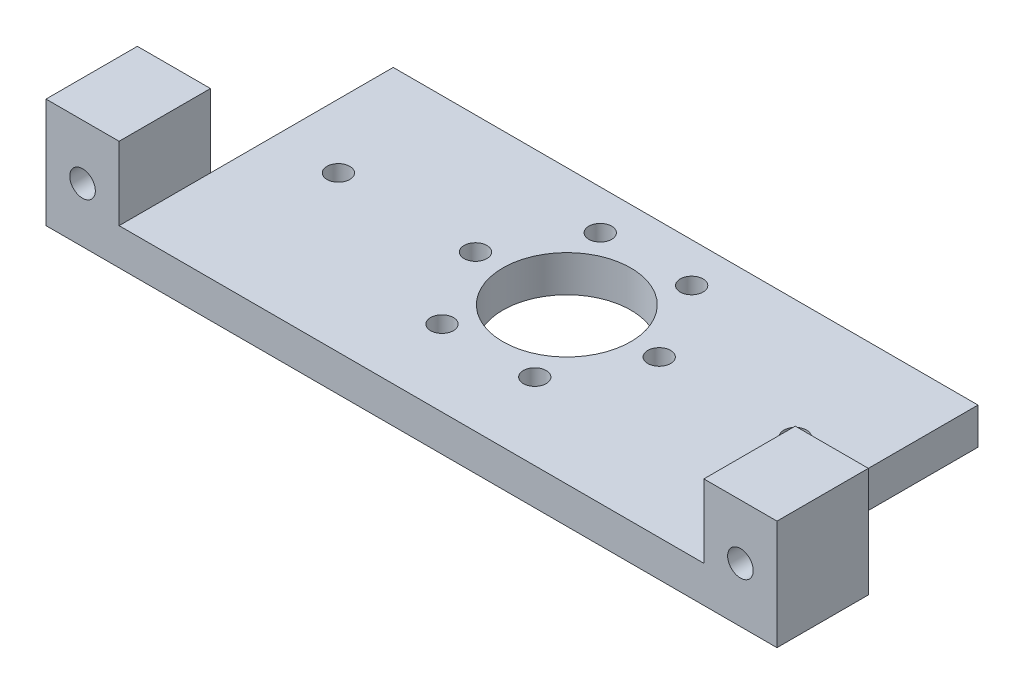
ISO-10303-21;
HEADER;
FILE_DESCRIPTION(('STEP AP214'),'2;1');
FILE_NAME('part.step','',(''),(''),'','','');
FILE_SCHEMA(('AUTOMOTIVE_DESIGN { 1 0 10303 214 1 1 1 1 }'));
ENDSEC;
DATA;
#1=APPLICATION_CONTEXT('core data for automotive mechanical design processes');
#2=APPLICATION_PROTOCOL_DEFINITION('international standard','automotive_design',2000,#1);
#3=PRODUCT_CONTEXT('',#1,'mechanical');
#4=PRODUCT('Part','Part','',(#3));
#5=PRODUCT_RELATED_PRODUCT_CATEGORY('part','',(#4));
#6=PRODUCT_DEFINITION_FORMATION('','',#4);
#7=PRODUCT_DEFINITION_CONTEXT('part definition',#1,'design');
#8=PRODUCT_DEFINITION('design','',#6,#7);
#9=PRODUCT_DEFINITION_SHAPE('','',#8);
#10=(LENGTH_UNIT() NAMED_UNIT(*) SI_UNIT(.MILLI.,.METRE.));
#11=(NAMED_UNIT(*) PLANE_ANGLE_UNIT() SI_UNIT($,.RADIAN.));
#12=(NAMED_UNIT(*) SI_UNIT($,.STERADIAN.) SOLID_ANGLE_UNIT());
#13=UNCERTAINTY_MEASURE_WITH_UNIT(LENGTH_MEASURE(1.E-05),#10,'distance_accuracy_value','');
#14=(GEOMETRIC_REPRESENTATION_CONTEXT(3) GLOBAL_UNCERTAINTY_ASSIGNED_CONTEXT((#13)) GLOBAL_UNIT_ASSIGNED_CONTEXT((#10,
#11,#12)) REPRESENTATION_CONTEXT('',''));
#15=CARTESIAN_POINT('',(0.,0.,0.));
#16=DIRECTION('',(0.,0.,1.));
#17=DIRECTION('',(1.,0.,0.));
#18=AXIS2_PLACEMENT_3D('',#15,#16,#17);
#19=CARTESIAN_POINT('',(0.,2.,0.));
#20=DIRECTION('',(0.,1.,0.));
#21=DIRECTION('',(0.,0.,1.));
#22=AXIS2_PLACEMENT_3D('',#19,#20,#21);
#23=PLANE('',#22);
#24=CARTESIAN_POINT('',(-52.3853811647955,2.,-8.1551724137931));
#25=DIRECTION('',(0.,1.,0.));
#26=DIRECTION('',(0.,0.,1.));
#27=AXIS2_PLACEMENT_3D('',#24,#25,#26);
#28=CIRCLE('',#27,0.624999999999994);
#29=CARTESIAN_POINT('',(-52.3853811647955,2.,-7.53017241379311));
#30=VERTEX_POINT('',#29);
#31=EDGE_CURVE('E227',#30,#30,#28,.T.);
#32=ORIENTED_EDGE('',*,*,#31,.F.);
#33=EDGE_LOOP('',(#32));
#34=FACE_BOUND('',#33,.T.);
#35=CARTESIAN_POINT('',(-27.3853811647955,2.,-8.15517241379311));
#36=DIRECTION('',(0.,1.,0.));
#37=DIRECTION('',(0.,0.,1.));
#38=AXIS2_PLACEMENT_3D('',#35,#36,#37);
#39=CIRCLE('',#38,0.624999999999992);
#40=CARTESIAN_POINT('',(-27.3853811647955,2.,-7.53017241379312));
#41=VERTEX_POINT('',#40);
#42=EDGE_CURVE('E233',#41,#41,#39,.T.);
#43=ORIENTED_EDGE('',*,*,#42,.F.);
#44=EDGE_LOOP('',(#43));
#45=FACE_BOUND('',#44,.T.);
#46=CARTESIAN_POINT('',(-44.8853811647955,2.,-8.1551724137931));
#47=DIRECTION('',(0.,1.,0.));
#48=DIRECTION('',(0.,0.,1.));
#49=AXIS2_PLACEMENT_3D('',#46,#47,#48);
#50=CIRCLE('',#49,0.624999999999987);
#51=CARTESIAN_POINT('',(-44.8853811647955,2.,-7.53017241379312));
#52=VERTEX_POINT('',#51);
#53=EDGE_CURVE('E188',#52,#52,#50,.T.);
#54=ORIENTED_EDGE('',*,*,#53,.F.);
#55=EDGE_LOOP('',(#54));
#56=FACE_BOUND('',#55,.T.);
#57=CARTESIAN_POINT('',(-42.3853811647955,2.,-12.4852994327153));
#58=DIRECTION('',(0.,1.,0.));
#59=DIRECTION('',(0.,0.,1.));
#60=AXIS2_PLACEMENT_3D('',#57,#58,#59);
#61=CIRCLE('',#60,0.624999999999987);
#62=CARTESIAN_POINT('',(-42.3853811647955,2.,-11.8602994327153));
#63=VERTEX_POINT('',#62);
#64=EDGE_CURVE('E245',#63,#63,#61,.T.);
#65=ORIENTED_EDGE('',*,*,#64,.F.);
#66=EDGE_LOOP('',(#65));
#67=FACE_BOUND('',#66,.T.);
#68=CARTESIAN_POINT('',(-37.3853811647954,2.,-12.4852994327153));
#69=DIRECTION('',(0.,1.,0.));
#70=DIRECTION('',(0.,0.,1.));
#71=AXIS2_PLACEMENT_3D('',#68,#69,#70);
#72=CIRCLE('',#71,0.624999999999987);
#73=CARTESIAN_POINT('',(-37.3853811647954,2.,-11.8602994327153));
#74=VERTEX_POINT('',#73);
#75=EDGE_CURVE('E251',#74,#74,#72,.T.);
#76=ORIENTED_EDGE('',*,*,#75,.F.);
#77=EDGE_LOOP('',(#76));
#78=FACE_BOUND('',#77,.T.);
#79=CARTESIAN_POINT('',(-34.8856846225404,2.,-8.21025857687513));
#80=DIRECTION('',(0.,1.,0.));
#81=DIRECTION('',(0.,0.,1.));
#82=AXIS2_PLACEMENT_3D('',#79,#80,#81);
#83=CIRCLE('',#82,0.624999999999987);
#84=CARTESIAN_POINT('',(-34.8856846225404,2.,-7.58525857687515));
#85=VERTEX_POINT('',#84);
#86=EDGE_CURVE('E257',#85,#85,#83,.T.);
#87=ORIENTED_EDGE('',*,*,#86,.F.);
#88=EDGE_LOOP('',(#87));
#89=FACE_BOUND('',#88,.T.);
#90=CARTESIAN_POINT('',(-37.3378268770419,2.,-3.85285127852804));
#91=DIRECTION('',(0.,1.,0.));
#92=DIRECTION('',(0.,0.,1.));
#93=AXIS2_PLACEMENT_3D('',#90,#91,#92);
#94=CIRCLE('',#93,0.624999999999987);
#95=CARTESIAN_POINT('',(-37.3378268770419,2.,-3.22785127852805));
#96=VERTEX_POINT('',#95);
#97=EDGE_CURVE('E263',#96,#96,#94,.T.);
#98=ORIENTED_EDGE('',*,*,#97,.F.);
#99=EDGE_LOOP('',(#98));
#100=FACE_BOUND('',#99,.T.);
#101=CARTESIAN_POINT('',(-42.3853811647955,2.,-3.82504539487091));
#102=DIRECTION('',(0.,1.,0.));
#103=DIRECTION('',(0.,0.,1.));
#104=AXIS2_PLACEMENT_3D('',#101,#102,#103);
#105=CIRCLE('',#104,0.624999999999987);
#106=CARTESIAN_POINT('',(-42.3853811647955,2.,-3.20004539487092));
#107=VERTEX_POINT('',#106);
#108=EDGE_CURVE('E269',#107,#107,#105,.T.);
#109=ORIENTED_EDGE('',*,*,#108,.F.);
#110=EDGE_LOOP('',(#109));
#111=FACE_BOUND('',#110,.T.);
#112=CARTESIAN_POINT('',(-39.8853811647955,2.,-8.1551724137931));
#113=DIRECTION('',(0.,1.,0.));
#114=DIRECTION('',(0.,0.,1.));
#115=AXIS2_PLACEMENT_3D('',#112,#113,#114);
#116=CIRCLE('',#115,3.49999999999999);
#117=CARTESIAN_POINT('',(-39.8853811647955,2.,-4.65517241379312));
#118=VERTEX_POINT('',#117);
#119=EDGE_CURVE('E161',#118,#118,#116,.T.);
#120=ORIENTED_EDGE('',*,*,#119,.F.);
#121=EDGE_LOOP('',(#120));
#122=FACE_BOUND('',#121,.T.);
#123=DIRECTION('',(1.,0.,0.));
#124=VECTOR('',#123,1.);
#125=CARTESIAN_POINT('',(-59.8853811647955,2.,0.344827586206901));
#126=LINE('',#125,#124);
#127=CARTESIAN_POINT('',(-55.8853811647955,2.,0.344827586206901));
#128=VERTEX_POINT('',#127);
#129=CARTESIAN_POINT('',(-23.8853811647955,2.,0.344827586206901));
#130=VERTEX_POINT('',#129);
#131=EDGE_CURVE('E171',#128,#130,#126,.T.);
#132=ORIENTED_EDGE('',*,*,#131,.T.);
#133=DIRECTION('',(0.,0.,1.));
#134=VECTOR('',#133,1.);
#135=CARTESIAN_POINT('',(-23.8853811647955,2.,-14.6551724137931));
#136=LINE('',#135,#134);
#137=CARTESIAN_POINT('',(-23.8853811647955,2.,-4.6551724137931));
#138=VERTEX_POINT('',#137);
#139=EDGE_CURVE('E286',#138,#130,#136,.T.);
#140=ORIENTED_EDGE('',*,*,#139,.F.);
#141=CARTESIAN_POINT('',(-23.8853811647955,2.,-14.6551724137931));
#142=VERTEX_POINT('',#141);
#143=EDGE_CURVE('E152',#142,#138,#136,.T.);
#144=ORIENTED_EDGE('',*,*,#143,.F.);
#145=DIRECTION('',(-1.,0.,0.));
#146=VECTOR('',#145,1.);
#147=CARTESIAN_POINT('',(-59.8853811647955,2.,-14.6551724137931));
#148=LINE('',#147,#146);
#149=CARTESIAN_POINT('',(-55.8853811647955,2.,-14.6551724137931));
#150=VERTEX_POINT('',#149);
#151=EDGE_CURVE('E168',#142,#150,#148,.T.);
#152=ORIENTED_EDGE('',*,*,#151,.T.);
#153=DIRECTION('',(0.,0.,-1.));
#154=VECTOR('',#153,1.);
#155=CARTESIAN_POINT('',(-55.8853811647955,2.,0.));
#156=LINE('',#155,#154);
#157=CARTESIAN_POINT('',(-55.8853811647955,2.,-4.6551724137931));
#158=VERTEX_POINT('',#157);
#159=EDGE_CURVE('E199',#158,#150,#156,.T.);
#160=ORIENTED_EDGE('',*,*,#159,.F.);
#161=DIRECTION('',(0.,0.,-1.));
#162=VECTOR('',#161,1.);
#163=CARTESIAN_POINT('',(-55.8853811647955,2.,-14.6551724137931));
#164=LINE('',#163,#162);
#165=EDGE_CURVE('E142',#128,#158,#164,.T.);
#166=ORIENTED_EDGE('',*,*,#165,.F.);
#167=EDGE_LOOP('',(#132,#140,#144,#152,#160,#166));
#168=FACE_BOUND('',#167,.T.);
#169=ADVANCED_FACE('F41',(#34,#45,#56,#67,#78,#89,#100,#111,#122,#168),#23,.T.);
#170=CARTESIAN_POINT('',(-19.8853811647955,2.,-14.6551724137931));
#171=DIRECTION('',(-1.,0.,0.));
#172=DIRECTION('',(0.,0.,1.));
#173=AXIS2_PLACEMENT_3D('',#170,#171,#172);
#174=PLANE('',#173);
#175=DIRECTION('',(0.,0.,-1.));
#176=VECTOR('',#175,1.);
#177=CARTESIAN_POINT('',(-19.8853811647955,0.,-14.6551724137931));
#178=LINE('',#177,#176);
#179=CARTESIAN_POINT('',(-19.8853811647955,0.,0.344827586206901));
#180=VERTEX_POINT('',#179);
#181=CARTESIAN_POINT('',(-19.8853811647955,0.,-4.6551724137931));
#182=VERTEX_POINT('',#181);
#183=EDGE_CURVE('E165',#180,#182,#178,.T.);
#184=ORIENTED_EDGE('',*,*,#183,.T.);
#185=DIRECTION('',(0.,-1.,0.));
#186=VECTOR('',#185,1.);
#187=CARTESIAN_POINT('',(-19.8853811647955,0.,-4.6551724137931));
#188=LINE('',#187,#186);
#189=CARTESIAN_POINT('',(-19.8853811647955,6.,-4.6551724137931));
#190=VERTEX_POINT('',#189);
#191=EDGE_CURVE('E215',#190,#182,#188,.T.);
#192=ORIENTED_EDGE('',*,*,#191,.F.);
#193=DIRECTION('',(0.,0.,-1.));
#194=VECTOR('',#193,1.);
#195=CARTESIAN_POINT('',(-19.8853811647955,6.,0.344827586206901));
#196=LINE('',#195,#194);
#197=CARTESIAN_POINT('',(-19.8853811647955,6.,0.344827586206901));
#198=VERTEX_POINT('',#197);
#199=EDGE_CURVE('E287',#198,#190,#196,.T.);
#200=ORIENTED_EDGE('',*,*,#199,.F.);
#201=DIRECTION('',(0.,-1.,0.));
#202=VECTOR('',#201,1.);
#203=CARTESIAN_POINT('',(-19.8853811647955,2.,0.344827586206901));
#204=LINE('',#203,#202);
#205=EDGE_CURVE('E50',#198,#180,#204,.T.);
#206=ORIENTED_EDGE('',*,*,#205,.T.);
#207=EDGE_LOOP('',(#184,#192,#200,#206));
#208=FACE_BOUND('',#207,.T.);
#209=ADVANCED_FACE('F43',(#208),#174,.F.);
#210=CARTESIAN_POINT('',(-59.8853811647955,2.,-14.6551724137931));
#211=DIRECTION('',(0.,0.,1.));
#212=DIRECTION('',(1.,0.,0.));
#213=AXIS2_PLACEMENT_3D('',#210,#211,#212);
#214=PLANE('',#213);
#215=DIRECTION('',(-1.,0.,0.));
#216=VECTOR('',#215,1.);
#217=CARTESIAN_POINT('',(-59.8853811647955,0.,-14.6551724137931));
#218=LINE('',#217,#216);
#219=CARTESIAN_POINT('',(-23.8853811647955,0.,-14.6551724137931));
#220=VERTEX_POINT('',#219);
#221=CARTESIAN_POINT('',(-55.8853811647955,0.,-14.6551724137931));
#222=VERTEX_POINT('',#221);
#223=EDGE_CURVE('E177',#220,#222,#218,.T.);
#224=ORIENTED_EDGE('',*,*,#223,.T.);
#225=DIRECTION('',(0.,-1.,0.));
#226=VECTOR('',#225,1.);
#227=CARTESIAN_POINT('',(-55.8853811647955,6.,-14.6551724137931));
#228=LINE('',#227,#226);
#229=EDGE_CURVE('E209',#150,#222,#228,.T.);
#230=ORIENTED_EDGE('',*,*,#229,.F.);
#231=ORIENTED_EDGE('',*,*,#151,.F.);
#232=DIRECTION('',(0.,1.,0.));
#233=VECTOR('',#232,1.);
#234=CARTESIAN_POINT('',(-23.8853811647955,0.,-14.6551724137931));
#235=LINE('',#234,#233);
#236=EDGE_CURVE('E213',#220,#142,#235,.T.);
#237=ORIENTED_EDGE('',*,*,#236,.F.);
#238=EDGE_LOOP('',(#224,#230,#231,#237));
#239=FACE_BOUND('',#238,.T.);
#240=ADVANCED_FACE('F308',(#239),#214,.F.);
#241=CARTESIAN_POINT('',(-59.8853811647955,2.,-14.6551724137931));
#242=DIRECTION('',(1.,0.,0.));
#243=DIRECTION('',(0.,0.,-1.));
#244=AXIS2_PLACEMENT_3D('',#241,#242,#243);
#245=PLANE('',#244);
#246=DIRECTION('',(0.,0.,1.));
#247=VECTOR('',#246,1.);
#248=CARTESIAN_POINT('',(-59.8853811647955,6.,0.344827586206901));
#249=LINE('',#248,#247);
#250=CARTESIAN_POINT('',(-59.8853811647955,6.,-4.6551724137931));
#251=VERTEX_POINT('',#250);
#252=CARTESIAN_POINT('',(-59.8853811647955,6.,0.344827586206901));
#253=VERTEX_POINT('',#252);
#254=EDGE_CURVE('E149',#251,#253,#249,.T.);
#255=ORIENTED_EDGE('',*,*,#254,.F.);
#256=DIRECTION('',(0.,1.,0.));
#257=VECTOR('',#256,1.);
#258=CARTESIAN_POINT('',(-59.8853811647955,6.,-4.6551724137931));
#259=LINE('',#258,#257);
#260=CARTESIAN_POINT('',(-59.8853811647955,0.,-4.6551724137931));
#261=VERTEX_POINT('',#260);
#262=EDGE_CURVE('E58',#261,#251,#259,.T.);
#263=ORIENTED_EDGE('',*,*,#262,.F.);
#264=DIRECTION('',(0.,0.,1.));
#265=VECTOR('',#264,1.);
#266=CARTESIAN_POINT('',(-59.8853811647955,0.,-14.6551724137931));
#267=LINE('',#266,#265);
#268=CARTESIAN_POINT('',(-59.8853811647955,0.,0.344827586206901));
#269=VERTEX_POINT('',#268);
#270=EDGE_CURVE('E180',#261,#269,#267,.T.);
#271=ORIENTED_EDGE('',*,*,#270,.T.);
#272=DIRECTION('',(0.,-1.,0.));
#273=VECTOR('',#272,1.);
#274=CARTESIAN_POINT('',(-59.8853811647955,2.,0.344827586206901));
#275=LINE('',#274,#273);
#276=EDGE_CURVE('E11',#253,#269,#275,.T.);
#277=ORIENTED_EDGE('',*,*,#276,.F.);
#278=EDGE_LOOP('',(#255,#263,#271,#277));
#279=FACE_BOUND('',#278,.T.);
#280=ADVANCED_FACE('F325',(#279),#245,.F.);
#281=CARTESIAN_POINT('',(-59.8853811647955,2.,0.344827586206901));
#282=DIRECTION('',(0.,0.,-1.));
#283=DIRECTION('',(-1.,0.,0.));
#284=AXIS2_PLACEMENT_3D('',#281,#282,#283);
#285=PLANE('',#284);
#286=CARTESIAN_POINT('',(-57.8853811647955,3.,0.344827586206901));
#287=DIRECTION('',(0.,0.,-1.));
#288=DIRECTION('',(-1.,0.,0.));
#289=AXIS2_PLACEMENT_3D('',#286,#287,#288);
#290=CIRCLE('',#289,0.700000000000001);
#291=CARTESIAN_POINT('',(-58.5853811647955,3.,0.344827586206901));
#292=VERTEX_POINT('',#291);
#293=EDGE_CURVE('E276',#292,#292,#290,.T.);
#294=ORIENTED_EDGE('',*,*,#293,.T.);
#295=EDGE_LOOP('',(#294));
#296=FACE_BOUND('',#295,.T.);
#297=CARTESIAN_POINT('',(-21.8853811647955,3.,0.344827586206901));
#298=DIRECTION('',(0.,0.,-1.));
#299=DIRECTION('',(-1.,0.,0.));
#300=AXIS2_PLACEMENT_3D('',#297,#298,#299);
#301=CIRCLE('',#300,0.699999999999998);
#302=CARTESIAN_POINT('',(-22.5853811647955,3.,0.344827586206901));
#303=VERTEX_POINT('',#302);
#304=EDGE_CURVE('E275',#303,#303,#301,.T.);
#305=ORIENTED_EDGE('',*,*,#304,.T.);
#306=EDGE_LOOP('',(#305));
#307=FACE_BOUND('',#306,.T.);
#308=DIRECTION('',(1.,0.,0.));
#309=VECTOR('',#308,1.);
#310=CARTESIAN_POINT('',(-59.8853811647955,0.,0.344827586206901));
#311=LINE('',#310,#309);
#312=EDGE_CURVE('E172',#269,#180,#311,.T.);
#313=ORIENTED_EDGE('',*,*,#312,.T.);
#314=ORIENTED_EDGE('',*,*,#205,.F.);
#315=DIRECTION('',(1.,0.,0.));
#316=VECTOR('',#315,1.);
#317=CARTESIAN_POINT('',(-23.8853811647955,6.,0.344827586206901));
#318=LINE('',#317,#316);
#319=CARTESIAN_POINT('',(-23.8853811647955,6.,0.344827586206901));
#320=VERTEX_POINT('',#319);
#321=EDGE_CURVE('E155',#320,#198,#318,.T.);
#322=ORIENTED_EDGE('',*,*,#321,.F.);
#323=DIRECTION('',(0.,-1.,0.));
#324=VECTOR('',#323,1.);
#325=CARTESIAN_POINT('',(-23.8853811647955,6.,0.344827586206901));
#326=LINE('',#325,#324);
#327=EDGE_CURVE('E279',#320,#130,#326,.T.);
#328=ORIENTED_EDGE('',*,*,#327,.T.);
#329=ORIENTED_EDGE('',*,*,#131,.F.);
#330=DIRECTION('',(0.,-1.,0.));
#331=VECTOR('',#330,1.);
#332=CARTESIAN_POINT('',(-55.8853811647955,6.,0.344827586206901));
#333=LINE('',#332,#331);
#334=CARTESIAN_POINT('',(-55.8853811647955,6.,0.344827586206901));
#335=VERTEX_POINT('',#334);
#336=EDGE_CURVE('E158',#335,#128,#333,.T.);
#337=ORIENTED_EDGE('',*,*,#336,.F.);
#338=DIRECTION('',(1.,0.,0.));
#339=VECTOR('',#338,1.);
#340=CARTESIAN_POINT('',(-55.8853811647955,6.,0.344827586206901));
#341=LINE('',#340,#339);
#342=EDGE_CURVE('E147',#253,#335,#341,.T.);
#343=ORIENTED_EDGE('',*,*,#342,.F.);
#344=ORIENTED_EDGE('',*,*,#276,.T.);
#345=EDGE_LOOP('',(#313,#314,#322,#328,#329,#337,#343,#344));
#346=FACE_BOUND('',#345,.T.);
#347=ADVANCED_FACE('F302',(#296,#307,#346),#285,.F.);
#348=CARTESIAN_POINT('',(0.,0.,0.));
#349=DIRECTION('',(0.,1.,0.));
#350=DIRECTION('',(0.,0.,1.));
#351=AXIS2_PLACEMENT_3D('',#348,#349,#350);
#352=PLANE('',#351);
#353=CARTESIAN_POINT('',(-27.3853811647955,0.,-8.15517241379311));
#354=DIRECTION('',(0.,1.,0.));
#355=DIRECTION('',(0.,0.,1.));
#356=AXIS2_PLACEMENT_3D('',#353,#354,#355);
#357=CIRCLE('',#356,1.);
#358=CARTESIAN_POINT('',(-27.3853811647955,0.,-7.15517241379311));
#359=VERTEX_POINT('',#358);
#360=EDGE_CURVE('E190',#359,#359,#357,.T.);
#361=ORIENTED_EDGE('',*,*,#360,.T.);
#362=EDGE_LOOP('',(#361));
#363=FACE_BOUND('',#362,.T.);
#364=CARTESIAN_POINT('',(-52.3853811647955,0.,-8.1551724137931));
#365=DIRECTION('',(0.,1.,0.));
#366=DIRECTION('',(0.,0.,1.));
#367=AXIS2_PLACEMENT_3D('',#364,#365,#366);
#368=CIRCLE('',#367,0.999999999999998);
#369=CARTESIAN_POINT('',(-52.3853811647955,0.,-7.1551724137931));
#370=VERTEX_POINT('',#369);
#371=EDGE_CURVE('E185',#370,#370,#368,.T.);
#372=ORIENTED_EDGE('',*,*,#371,.T.);
#373=EDGE_LOOP('',(#372));
#374=FACE_BOUND('',#373,.T.);
#375=CARTESIAN_POINT('',(-44.8853811647955,0.,-8.1551724137931));
#376=DIRECTION('',(0.,1.,0.));
#377=DIRECTION('',(0.,0.,1.));
#378=AXIS2_PLACEMENT_3D('',#375,#376,#377);
#379=CIRCLE('',#378,0.624999999999987);
#380=CARTESIAN_POINT('',(-44.8853811647955,0.,-7.53017241379312));
#381=VERTEX_POINT('',#380);
#382=EDGE_CURVE('E242',#381,#381,#379,.T.);
#383=ORIENTED_EDGE('',*,*,#382,.T.);
#384=EDGE_LOOP('',(#383));
#385=FACE_BOUND('',#384,.T.);
#386=CARTESIAN_POINT('',(-42.3853811647955,0.,-12.4852994327153));
#387=DIRECTION('',(0.,1.,0.));
#388=DIRECTION('',(0.,0.,1.));
#389=AXIS2_PLACEMENT_3D('',#386,#387,#388);
#390=CIRCLE('',#389,0.624999999999987);
#391=CARTESIAN_POINT('',(-42.3853811647955,0.,-11.8602994327153));
#392=VERTEX_POINT('',#391);
#393=EDGE_CURVE('E248',#392,#392,#390,.T.);
#394=ORIENTED_EDGE('',*,*,#393,.T.);
#395=EDGE_LOOP('',(#394));
#396=FACE_BOUND('',#395,.T.);
#397=CARTESIAN_POINT('',(-37.3853811647954,0.,-12.4852994327153));
#398=DIRECTION('',(0.,1.,0.));
#399=DIRECTION('',(0.,0.,1.));
#400=AXIS2_PLACEMENT_3D('',#397,#398,#399);
#401=CIRCLE('',#400,0.624999999999987);
#402=CARTESIAN_POINT('',(-37.3853811647954,0.,-11.8602994327153));
#403=VERTEX_POINT('',#402);
#404=EDGE_CURVE('E254',#403,#403,#401,.T.);
#405=ORIENTED_EDGE('',*,*,#404,.T.);
#406=EDGE_LOOP('',(#405));
#407=FACE_BOUND('',#406,.T.);
#408=CARTESIAN_POINT('',(-34.8856846225404,0.,-8.21025857687513));
#409=DIRECTION('',(0.,1.,0.));
#410=DIRECTION('',(0.,0.,1.));
#411=AXIS2_PLACEMENT_3D('',#408,#409,#410);
#412=CIRCLE('',#411,0.624999999999987);
#413=CARTESIAN_POINT('',(-34.8856846225404,0.,-7.58525857687515));
#414=VERTEX_POINT('',#413);
#415=EDGE_CURVE('E260',#414,#414,#412,.T.);
#416=ORIENTED_EDGE('',*,*,#415,.T.);
#417=EDGE_LOOP('',(#416));
#418=FACE_BOUND('',#417,.T.);
#419=CARTESIAN_POINT('',(-37.3378268770419,0.,-3.85285127852804));
#420=DIRECTION('',(0.,1.,0.));
#421=DIRECTION('',(0.,0.,1.));
#422=AXIS2_PLACEMENT_3D('',#419,#420,#421);
#423=CIRCLE('',#422,0.624999999999987);
#424=CARTESIAN_POINT('',(-37.3378268770419,0.,-3.22785127852805));
#425=VERTEX_POINT('',#424);
#426=EDGE_CURVE('E266',#425,#425,#423,.T.);
#427=ORIENTED_EDGE('',*,*,#426,.T.);
#428=EDGE_LOOP('',(#427));
#429=FACE_BOUND('',#428,.T.);
#430=CARTESIAN_POINT('',(-42.3853811647955,0.,-3.82504539487091));
#431=DIRECTION('',(0.,1.,0.));
#432=DIRECTION('',(0.,0.,1.));
#433=AXIS2_PLACEMENT_3D('',#430,#431,#432);
#434=CIRCLE('',#433,0.624999999999987);
#435=CARTESIAN_POINT('',(-42.3853811647955,0.,-3.20004539487092));
#436=VERTEX_POINT('',#435);
#437=EDGE_CURVE('E272',#436,#436,#434,.T.);
#438=ORIENTED_EDGE('',*,*,#437,.T.);
#439=EDGE_LOOP('',(#438));
#440=FACE_BOUND('',#439,.T.);
#441=CARTESIAN_POINT('',(-39.8853811647955,0.,-8.1551724137931));
#442=DIRECTION('',(0.,1.,0.));
#443=DIRECTION('',(0.,0.,1.));
#444=AXIS2_PLACEMENT_3D('',#441,#442,#443);
#445=CIRCLE('',#444,3.49999999999999);
#446=CARTESIAN_POINT('',(-39.8853811647955,0.,-4.65517241379312));
#447=VERTEX_POINT('',#446);
#448=EDGE_CURVE('E162',#447,#447,#445,.T.);
#449=ORIENTED_EDGE('',*,*,#448,.T.);
#450=EDGE_LOOP('',(#449));
#451=FACE_BOUND('',#450,.T.);
#452=DIRECTION('',(-1.,0.,0.));
#453=VECTOR('',#452,1.);
#454=CARTESIAN_POINT('',(-59.8853811647955,0.,-4.6551724137931));
#455=LINE('',#454,#453);
#456=CARTESIAN_POINT('',(-55.8853811647955,0.,-4.6551724137931));
#457=VERTEX_POINT('',#456);
#458=EDGE_CURVE('E143',#457,#261,#455,.T.);
#459=ORIENTED_EDGE('',*,*,#458,.F.);
#460=DIRECTION('',(0.,0.,-1.));
#461=VECTOR('',#460,1.);
#462=CARTESIAN_POINT('',(-55.8853811647955,0.,-4.6551724137931));
#463=LINE('',#462,#461);
#464=EDGE_CURVE('E195',#457,#222,#463,.T.);
#465=ORIENTED_EDGE('',*,*,#464,.T.);
#466=ORIENTED_EDGE('',*,*,#223,.F.);
#467=DIRECTION('',(0.,0.,-1.));
#468=VECTOR('',#467,1.);
#469=CARTESIAN_POINT('',(-23.8853811647955,0.,-4.6551724137931));
#470=LINE('',#469,#468);
#471=CARTESIAN_POINT('',(-23.8853811647955,0.,-4.6551724137931));
#472=VERTEX_POINT('',#471);
#473=EDGE_CURVE('E210',#472,#220,#470,.T.);
#474=ORIENTED_EDGE('',*,*,#473,.F.);
#475=DIRECTION('',(-1.,0.,0.));
#476=VECTOR('',#475,1.);
#477=CARTESIAN_POINT('',(-19.8853811647955,0.,-4.6551724137931));
#478=LINE('',#477,#476);
#479=EDGE_CURVE('E219',#182,#472,#478,.T.);
#480=ORIENTED_EDGE('',*,*,#479,.F.);
#481=ORIENTED_EDGE('',*,*,#183,.F.);
#482=ORIENTED_EDGE('',*,*,#312,.F.);
#483=ORIENTED_EDGE('',*,*,#270,.F.);
#484=EDGE_LOOP('',(#459,#465,#466,#474,#480,#481,#482,#483));
#485=FACE_BOUND('',#484,.T.);
#486=ADVANCED_FACE('F312',(#363,#374,#385,#396,#407,#418,#429,#440,#451,#485),#352,.F.);
#487=CARTESIAN_POINT('',(-39.8853811647955,0.,-8.1551724137931));
#488=DIRECTION('',(0.,1.,0.));
#489=DIRECTION('',(0.,0.,1.));
#490=AXIS2_PLACEMENT_3D('',#487,#488,#489);
#491=CYLINDRICAL_SURFACE('',#490,3.49999999999999);
#492=ORIENTED_EDGE('',*,*,#448,.F.);
#493=EDGE_LOOP('',(#492));
#494=FACE_BOUND('',#493,.T.);
#495=ORIENTED_EDGE('',*,*,#119,.T.);
#496=EDGE_LOOP('',(#495));
#497=FACE_BOUND('',#496,.T.);
#498=ADVANCED_FACE('F346',(#494,#497),#491,.F.);
#499=CARTESIAN_POINT('',(-55.8853811647955,6.,-14.6551724137931));
#500=DIRECTION('',(-1.,0.,0.));
#501=DIRECTION('',(0.,0.,1.));
#502=AXIS2_PLACEMENT_3D('',#499,#500,#501);
#503=PLANE('',#502);
#504=ORIENTED_EDGE('',*,*,#165,.T.);
#505=DIRECTION('',(0.,-1.,0.));
#506=VECTOR('',#505,1.);
#507=CARTESIAN_POINT('',(-55.8853811647955,6.,-4.6551724137931));
#508=LINE('',#507,#506);
#509=CARTESIAN_POINT('',(-55.8853811647955,6.,-4.6551724137931));
#510=VERTEX_POINT('',#509);
#511=EDGE_CURVE('E129',#510,#158,#508,.T.);
#512=ORIENTED_EDGE('',*,*,#511,.F.);
#513=DIRECTION('',(0.,0.,-1.));
#514=VECTOR('',#513,1.);
#515=CARTESIAN_POINT('',(-55.8853811647955,6.,-14.6551724137931));
#516=LINE('',#515,#514);
#517=EDGE_CURVE('E141',#335,#510,#516,.T.);
#518=ORIENTED_EDGE('',*,*,#517,.F.);
#519=ORIENTED_EDGE('',*,*,#336,.T.);
#520=EDGE_LOOP('',(#504,#512,#518,#519));
#521=FACE_BOUND('',#520,.T.);
#522=ADVANCED_FACE('F139',(#521),#503,.F.);
#523=CARTESIAN_POINT('',(0.,6.,0.));
#524=DIRECTION('',(0.,-1.,0.));
#525=DIRECTION('',(0.,0.,-1.));
#526=AXIS2_PLACEMENT_3D('',#523,#524,#525);
#527=PLANE('',#526);
#528=ORIENTED_EDGE('',*,*,#517,.T.);
#529=DIRECTION('',(1.,0.,0.));
#530=VECTOR('',#529,1.);
#531=CARTESIAN_POINT('',(-59.8853811647955,6.,-4.6551724137931));
#532=LINE('',#531,#530);
#533=EDGE_CURVE('E125',#251,#510,#532,.T.);
#534=ORIENTED_EDGE('',*,*,#533,.F.);
#535=ORIENTED_EDGE('',*,*,#254,.T.);
#536=ORIENTED_EDGE('',*,*,#342,.T.);
#537=EDGE_LOOP('',(#528,#534,#535,#536));
#538=FACE_BOUND('',#537,.T.);
#539=ADVANCED_FACE('F145',(#538),#527,.F.);
#540=CARTESIAN_POINT('',(-23.8853811647955,6.,-14.6551724137931));
#541=DIRECTION('',(1.,0.,0.));
#542=DIRECTION('',(0.,0.,-1.));
#543=AXIS2_PLACEMENT_3D('',#540,#541,#542);
#544=PLANE('',#543);
#545=DIRECTION('',(0.,0.,1.));
#546=VECTOR('',#545,1.);
#547=CARTESIAN_POINT('',(-23.8853811647955,6.,-14.6551724137931));
#548=LINE('',#547,#546);
#549=CARTESIAN_POINT('',(-23.8853811647955,6.,-4.6551724137931));
#550=VERTEX_POINT('',#549);
#551=EDGE_CURVE('E284',#550,#320,#548,.T.);
#552=ORIENTED_EDGE('',*,*,#551,.F.);
#553=DIRECTION('',(0.,1.,0.));
#554=VECTOR('',#553,1.);
#555=CARTESIAN_POINT('',(-23.8853811647955,0.,-4.6551724137931));
#556=LINE('',#555,#554);
#557=EDGE_CURVE('E66',#138,#550,#556,.T.);
#558=ORIENTED_EDGE('',*,*,#557,.F.);
#559=ORIENTED_EDGE('',*,*,#139,.T.);
#560=ORIENTED_EDGE('',*,*,#327,.F.);
#561=EDGE_LOOP('',(#552,#558,#559,#560));
#562=FACE_BOUND('',#561,.T.);
#563=ADVANCED_FACE('F297',(#562),#544,.F.);
#564=CARTESIAN_POINT('',(0.,6.,0.));
#565=DIRECTION('',(0.,1.,0.));
#566=DIRECTION('',(0.,0.,1.));
#567=AXIS2_PLACEMENT_3D('',#564,#565,#566);
#568=PLANE('',#567);
#569=DIRECTION('',(1.,0.,0.));
#570=VECTOR('',#569,1.);
#571=CARTESIAN_POINT('',(-19.8853811647955,6.,-4.6551724137931));
#572=LINE('',#571,#570);
#573=EDGE_CURVE('E212',#550,#190,#572,.T.);
#574=ORIENTED_EDGE('',*,*,#573,.F.);
#575=ORIENTED_EDGE('',*,*,#551,.T.);
#576=ORIENTED_EDGE('',*,*,#321,.T.);
#577=ORIENTED_EDGE('',*,*,#199,.T.);
#578=EDGE_LOOP('',(#574,#575,#576,#577));
#579=FACE_BOUND('',#578,.T.);
#580=ADVANCED_FACE('F396',(#579),#568,.T.);
#581=CARTESIAN_POINT('',(-21.8853811647955,3.,0.344827586206901));
#582=DIRECTION('',(0.,0.,-1.));
#583=DIRECTION('',(-1.,0.,0.));
#584=AXIS2_PLACEMENT_3D('',#581,#582,#583);
#585=CYLINDRICAL_SURFACE('',#584,0.699999999999998);
#586=CARTESIAN_POINT('',(-21.8853811647955,3.,-4.6551724137931));
#587=DIRECTION('',(0.,0.,1.));
#588=DIRECTION('',(1.,0.,0.));
#589=AXIS2_PLACEMENT_3D('',#586,#587,#588);
#590=CIRCLE('',#589,0.699999999999998);
#591=CARTESIAN_POINT('',(-21.1853811647955,3.,-4.6551724137931));
#592=VERTEX_POINT('',#591);
#593=EDGE_CURVE('E45',#592,#592,#590,.F.);
#594=ORIENTED_EDGE('',*,*,#593,.T.);
#595=EDGE_LOOP('',(#594));
#596=FACE_BOUND('',#595,.T.);
#597=ORIENTED_EDGE('',*,*,#304,.F.);
#598=EDGE_LOOP('',(#597));
#599=FACE_BOUND('',#598,.T.);
#600=ADVANCED_FACE('F390',(#596,#599),#585,.F.);
#601=CARTESIAN_POINT('',(-57.8853811647955,3.,0.344827586206901));
#602=DIRECTION('',(0.,0.,-1.));
#603=DIRECTION('',(-1.,0.,0.));
#604=AXIS2_PLACEMENT_3D('',#601,#602,#603);
#605=CYLINDRICAL_SURFACE('',#604,0.700000000000001);
#606=CARTESIAN_POINT('',(-57.8853811647955,3.,-4.6551724137931));
#607=DIRECTION('',(0.,0.,1.));
#608=DIRECTION('',(1.,0.,0.));
#609=AXIS2_PLACEMENT_3D('',#606,#607,#608);
#610=CIRCLE('',#609,0.700000000000001);
#611=CARTESIAN_POINT('',(-57.1853811647955,3.,-4.6551724137931));
#612=VERTEX_POINT('',#611);
#613=EDGE_CURVE('E193',#612,#612,#610,.F.);
#614=ORIENTED_EDGE('',*,*,#613,.T.);
#615=EDGE_LOOP('',(#614));
#616=FACE_BOUND('',#615,.T.);
#617=ORIENTED_EDGE('',*,*,#293,.F.);
#618=EDGE_LOOP('',(#617));
#619=FACE_BOUND('',#618,.T.);
#620=ADVANCED_FACE('F379',(#616,#619),#605,.F.);
#621=CARTESIAN_POINT('',(-42.3853811647955,2.,-3.82504539487091));
#622=DIRECTION('',(0.,1.,0.));
#623=DIRECTION('',(0.,0.,1.));
#624=AXIS2_PLACEMENT_3D('',#621,#622,#623);
#625=CYLINDRICAL_SURFACE('',#624,0.624999999999987);
#626=ORIENTED_EDGE('',*,*,#437,.F.);
#627=EDGE_LOOP('',(#626));
#628=FACE_BOUND('',#627,.T.);
#629=ORIENTED_EDGE('',*,*,#108,.T.);
#630=EDGE_LOOP('',(#629));
#631=FACE_BOUND('',#630,.T.);
#632=ADVANCED_FACE('F375',(#628,#631),#625,.F.);
#633=CARTESIAN_POINT('',(-37.3378268770419,2.,-3.85285127852804));
#634=DIRECTION('',(0.,1.,0.));
#635=DIRECTION('',(0.,0.,1.));
#636=AXIS2_PLACEMENT_3D('',#633,#634,#635);
#637=CYLINDRICAL_SURFACE('',#636,0.624999999999987);
#638=ORIENTED_EDGE('',*,*,#426,.F.);
#639=EDGE_LOOP('',(#638));
#640=FACE_BOUND('',#639,.T.);
#641=ORIENTED_EDGE('',*,*,#97,.T.);
#642=EDGE_LOOP('',(#641));
#643=FACE_BOUND('',#642,.T.);
#644=ADVANCED_FACE('F378',(#640,#643),#637,.F.);
#645=CARTESIAN_POINT('',(-34.8856846225404,2.,-8.21025857687513));
#646=DIRECTION('',(0.,1.,0.));
#647=DIRECTION('',(0.,0.,1.));
#648=AXIS2_PLACEMENT_3D('',#645,#646,#647);
#649=CYLINDRICAL_SURFACE('',#648,0.624999999999987);
#650=ORIENTED_EDGE('',*,*,#415,.F.);
#651=EDGE_LOOP('',(#650));
#652=FACE_BOUND('',#651,.T.);
#653=ORIENTED_EDGE('',*,*,#86,.T.);
#654=EDGE_LOOP('',(#653));
#655=FACE_BOUND('',#654,.T.);
#656=ADVANCED_FACE('F386',(#652,#655),#649,.F.);
#657=CARTESIAN_POINT('',(-37.3853811647954,2.,-12.4852994327153));
#658=DIRECTION('',(0.,1.,0.));
#659=DIRECTION('',(0.,0.,1.));
#660=AXIS2_PLACEMENT_3D('',#657,#658,#659);
#661=CYLINDRICAL_SURFACE('',#660,0.624999999999987);
#662=ORIENTED_EDGE('',*,*,#404,.F.);
#663=EDGE_LOOP('',(#662));
#664=FACE_BOUND('',#663,.T.);
#665=ORIENTED_EDGE('',*,*,#75,.T.);
#666=EDGE_LOOP('',(#665));
#667=FACE_BOUND('',#666,.T.);
#668=ADVANCED_FACE('F534',(#664,#667),#661,.F.);
#669=CARTESIAN_POINT('',(-42.3853811647955,2.,-12.4852994327153));
#670=DIRECTION('',(0.,1.,0.));
#671=DIRECTION('',(0.,0.,1.));
#672=AXIS2_PLACEMENT_3D('',#669,#670,#671);
#673=CYLINDRICAL_SURFACE('',#672,0.624999999999987);
#674=ORIENTED_EDGE('',*,*,#393,.F.);
#675=EDGE_LOOP('',(#674));
#676=FACE_BOUND('',#675,.T.);
#677=ORIENTED_EDGE('',*,*,#64,.T.);
#678=EDGE_LOOP('',(#677));
#679=FACE_BOUND('',#678,.T.);
#680=ADVANCED_FACE('F525',(#676,#679),#673,.F.);
#681=CARTESIAN_POINT('',(-44.8853811647955,2.,-8.1551724137931));
#682=DIRECTION('',(0.,1.,0.));
#683=DIRECTION('',(0.,0.,1.));
#684=AXIS2_PLACEMENT_3D('',#681,#682,#683);
#685=CYLINDRICAL_SURFACE('',#684,0.624999999999987);
#686=ORIENTED_EDGE('',*,*,#382,.F.);
#687=EDGE_LOOP('',(#686));
#688=FACE_BOUND('',#687,.T.);
#689=ORIENTED_EDGE('',*,*,#53,.T.);
#690=EDGE_LOOP('',(#689));
#691=FACE_BOUND('',#690,.T.);
#692=ADVANCED_FACE('F516',(#688,#691),#685,.F.);
#693=CARTESIAN_POINT('',(-52.3853811647955,-2.,-8.1551724137931));
#694=DIRECTION('',(0.,1.,0.));
#695=DIRECTION('',(0.,0.,1.));
#696=AXIS2_PLACEMENT_3D('',#693,#694,#695);
#697=CYLINDRICAL_SURFACE('',#696,0.999999999999998);
#698=CARTESIAN_POINT('',(-52.3853811647955,-2.,-8.1551724137931));
#699=DIRECTION('',(0.,1.,0.));
#700=DIRECTION('',(0.,0.,1.));
#701=AXIS2_PLACEMENT_3D('',#698,#699,#700);
#702=CIRCLE('',#701,0.999999999999998);
#703=CARTESIAN_POINT('',(-52.3853811647955,-2.,-7.1551724137931));
#704=VERTEX_POINT('',#703);
#705=EDGE_CURVE('E189',#704,#704,#702,.T.);
#706=ORIENTED_EDGE('',*,*,#705,.T.);
#707=EDGE_LOOP('',(#706));
#708=FACE_BOUND('',#707,.T.);
#709=ORIENTED_EDGE('',*,*,#371,.F.);
#710=EDGE_LOOP('',(#709));
#711=FACE_BOUND('',#710,.T.);
#712=ADVANCED_FACE('F507',(#708,#711),#697,.T.);
#713=CARTESIAN_POINT('',(-52.3853811647955,-2.,-8.1551724137931));
#714=DIRECTION('',(0.,1.,0.));
#715=DIRECTION('',(0.,0.,1.));
#716=AXIS2_PLACEMENT_3D('',#713,#714,#715);
#717=PLANE('',#716);
#718=CARTESIAN_POINT('',(-52.3853811647955,-2.,-8.1551724137931));
#719=DIRECTION('',(0.,-1.,0.));
#720=DIRECTION('',(0.,0.,-1.));
#721=AXIS2_PLACEMENT_3D('',#718,#719,#720);
#722=CIRCLE('',#721,0.624999999999987);
#723=CARTESIAN_POINT('',(-52.3853811647955,-2.,-8.78017241379309));
#724=VERTEX_POINT('',#723);
#725=EDGE_CURVE('E224',#724,#724,#722,.T.);
#726=ORIENTED_EDGE('',*,*,#725,.F.);
#727=EDGE_LOOP('',(#726));
#728=FACE_BOUND('',#727,.T.);
#729=ORIENTED_EDGE('',*,*,#705,.F.);
#730=EDGE_LOOP('',(#729));
#731=FACE_BOUND('',#730,.T.);
#732=ADVANCED_FACE('F498',(#728,#731),#717,.F.);
#733=CARTESIAN_POINT('',(-27.3853811647955,-2.,-8.15517241379311));
#734=DIRECTION('',(0.,1.,0.));
#735=DIRECTION('',(0.,0.,1.));
#736=AXIS2_PLACEMENT_3D('',#733,#734,#735);
#737=CYLINDRICAL_SURFACE('',#736,1.);
#738=CARTESIAN_POINT('',(-27.3853811647955,-2.,-8.15517241379311));
#739=DIRECTION('',(0.,1.,0.));
#740=DIRECTION('',(0.,0.,1.));
#741=AXIS2_PLACEMENT_3D('',#738,#739,#740);
#742=CIRCLE('',#741,1.);
#743=CARTESIAN_POINT('',(-27.3853811647955,-2.,-7.15517241379311));
#744=VERTEX_POINT('',#743);
#745=EDGE_CURVE('E192',#744,#744,#742,.T.);
#746=ORIENTED_EDGE('',*,*,#745,.T.);
#747=EDGE_LOOP('',(#746));
#748=FACE_BOUND('',#747,.T.);
#749=ORIENTED_EDGE('',*,*,#360,.F.);
#750=EDGE_LOOP('',(#749));
#751=FACE_BOUND('',#750,.T.);
#752=ADVANCED_FACE('F489',(#748,#751),#737,.T.);
#753=CARTESIAN_POINT('',(-27.3853811647955,-2.,-8.15517241379311));
#754=DIRECTION('',(0.,1.,0.));
#755=DIRECTION('',(0.,0.,1.));
#756=AXIS2_PLACEMENT_3D('',#753,#754,#755);
#757=PLANE('',#756);
#758=CARTESIAN_POINT('',(-27.3853811647955,-2.,-8.15517241379311));
#759=DIRECTION('',(0.,-1.,0.));
#760=DIRECTION('',(0.,0.,-1.));
#761=AXIS2_PLACEMENT_3D('',#758,#759,#760);
#762=CIRCLE('',#761,0.624999999999987);
#763=CARTESIAN_POINT('',(-27.3853811647955,-2.,-8.78017241379309));
#764=VERTEX_POINT('',#763);
#765=EDGE_CURVE('E230',#764,#764,#762,.T.);
#766=ORIENTED_EDGE('',*,*,#765,.F.);
#767=EDGE_LOOP('',(#766));
#768=FACE_BOUND('',#767,.T.);
#769=ORIENTED_EDGE('',*,*,#745,.F.);
#770=EDGE_LOOP('',(#769));
#771=FACE_BOUND('',#770,.T.);
#772=ADVANCED_FACE('F480',(#768,#771),#757,.F.);
#773=CARTESIAN_POINT('',(-27.3853811647955,-2.,-8.15517241379311));
#774=DIRECTION('',(0.,-1.,0.));
#775=DIRECTION('',(0.,0.,-1.));
#776=AXIS2_PLACEMENT_3D('',#773,#774,#775);
#777=CYLINDRICAL_SURFACE('',#776,0.624999999999992);
#778=ORIENTED_EDGE('',*,*,#42,.T.);
#779=EDGE_LOOP('',(#778));
#780=FACE_BOUND('',#779,.T.);
#781=ORIENTED_EDGE('',*,*,#765,.T.);
#782=EDGE_LOOP('',(#781));
#783=FACE_BOUND('',#782,.T.);
#784=ADVANCED_FACE('F471',(#780,#783),#777,.F.);
#785=CARTESIAN_POINT('',(-52.3853811647955,-2.,-8.1551724137931));
#786=DIRECTION('',(0.,-1.,0.));
#787=DIRECTION('',(0.,0.,-1.));
#788=AXIS2_PLACEMENT_3D('',#785,#786,#787);
#789=CYLINDRICAL_SURFACE('',#788,0.624999999999994);
#790=ORIENTED_EDGE('',*,*,#31,.T.);
#791=EDGE_LOOP('',(#790));
#792=FACE_BOUND('',#791,.T.);
#793=ORIENTED_EDGE('',*,*,#725,.T.);
#794=EDGE_LOOP('',(#793));
#795=FACE_BOUND('',#794,.T.);
#796=ADVANCED_FACE('F438',(#792,#795),#789,.F.);
#797=CARTESIAN_POINT('',(0.,0.,-4.6551724137931));
#798=DIRECTION('',(0.,0.,1.));
#799=DIRECTION('',(1.,0.,0.));
#800=AXIS2_PLACEMENT_3D('',#797,#798,#799);
#801=PLANE('',#800);
#802=ORIENTED_EDGE('',*,*,#262,.T.);
#803=ORIENTED_EDGE('',*,*,#533,.T.);
#804=ORIENTED_EDGE('',*,*,#511,.T.);
#805=EDGE_CURVE('E134',#158,#457,#508,.T.);
#806=ORIENTED_EDGE('',*,*,#805,.T.);
#807=ORIENTED_EDGE('',*,*,#458,.T.);
#808=EDGE_LOOP('',(#802,#803,#804,#806,#807));
#809=FACE_BOUND('',#808,.T.);
#810=ORIENTED_EDGE('',*,*,#613,.F.);
#811=EDGE_LOOP('',(#810));
#812=FACE_BOUND('',#811,.T.);
#813=ADVANCED_FACE('F127',(#809,#812),#801,.F.);
#814=CARTESIAN_POINT('',(-55.8853811647955,6.,-4.6551724137931));
#815=DIRECTION('',(1.,0.,0.));
#816=DIRECTION('',(0.,0.,-1.));
#817=AXIS2_PLACEMENT_3D('',#814,#815,#816);
#818=PLANE('',#817);
#819=ORIENTED_EDGE('',*,*,#159,.T.);
#820=ORIENTED_EDGE('',*,*,#229,.T.);
#821=ORIENTED_EDGE('',*,*,#464,.F.);
#822=ORIENTED_EDGE('',*,*,#805,.F.);
#823=EDGE_LOOP('',(#819,#820,#821,#822));
#824=FACE_BOUND('',#823,.T.);
#825=ADVANCED_FACE('F306',(#824),#818,.F.);
#826=CARTESIAN_POINT('',(0.,0.,-4.6551724137931));
#827=DIRECTION('',(0.,0.,1.));
#828=DIRECTION('',(1.,0.,0.));
#829=AXIS2_PLACEMENT_3D('',#826,#827,#828);
#830=PLANE('',#829);
#831=ORIENTED_EDGE('',*,*,#191,.T.);
#832=ORIENTED_EDGE('',*,*,#479,.T.);
#833=EDGE_CURVE('E217',#472,#138,#556,.T.);
#834=ORIENTED_EDGE('',*,*,#833,.T.);
#835=ORIENTED_EDGE('',*,*,#557,.T.);
#836=ORIENTED_EDGE('',*,*,#573,.T.);
#837=EDGE_LOOP('',(#831,#832,#834,#835,#836));
#838=FACE_BOUND('',#837,.T.);
#839=ORIENTED_EDGE('',*,*,#593,.F.);
#840=EDGE_LOOP('',(#839));
#841=FACE_BOUND('',#840,.T.);
#842=ADVANCED_FACE('F317',(#838,#841),#830,.F.);
#843=CARTESIAN_POINT('',(-23.8853811647955,0.,-4.6551724137931));
#844=DIRECTION('',(-1.,0.,0.));
#845=DIRECTION('',(0.,0.,1.));
#846=AXIS2_PLACEMENT_3D('',#843,#844,#845);
#847=PLANE('',#846);
#848=ORIENTED_EDGE('',*,*,#143,.T.);
#849=ORIENTED_EDGE('',*,*,#833,.F.);
#850=ORIENTED_EDGE('',*,*,#473,.T.);
#851=ORIENTED_EDGE('',*,*,#236,.T.);
#852=EDGE_LOOP('',(#848,#849,#850,#851));
#853=FACE_BOUND('',#852,.T.);
#854=ADVANCED_FACE('F316',(#853),#847,.F.);
#855=CLOSED_SHELL('',(#169,#209,#240,#280,#347,#486,#498,#522,#539,#563,#580,#600,#620,#632,
#644,#656,#668,#680,#692,#712,#732,#752,#772,#784,#796,#813,#825,#842,#854));
#856=MANIFOLD_SOLID_BREP('B2',#855);
#857=ADVANCED_BREP_SHAPE_REPRESENTATION('',(#18,#856),#14);
#858=SHAPE_DEFINITION_REPRESENTATION(#9,#857);
ENDSEC;
END-ISO-10303-21;
